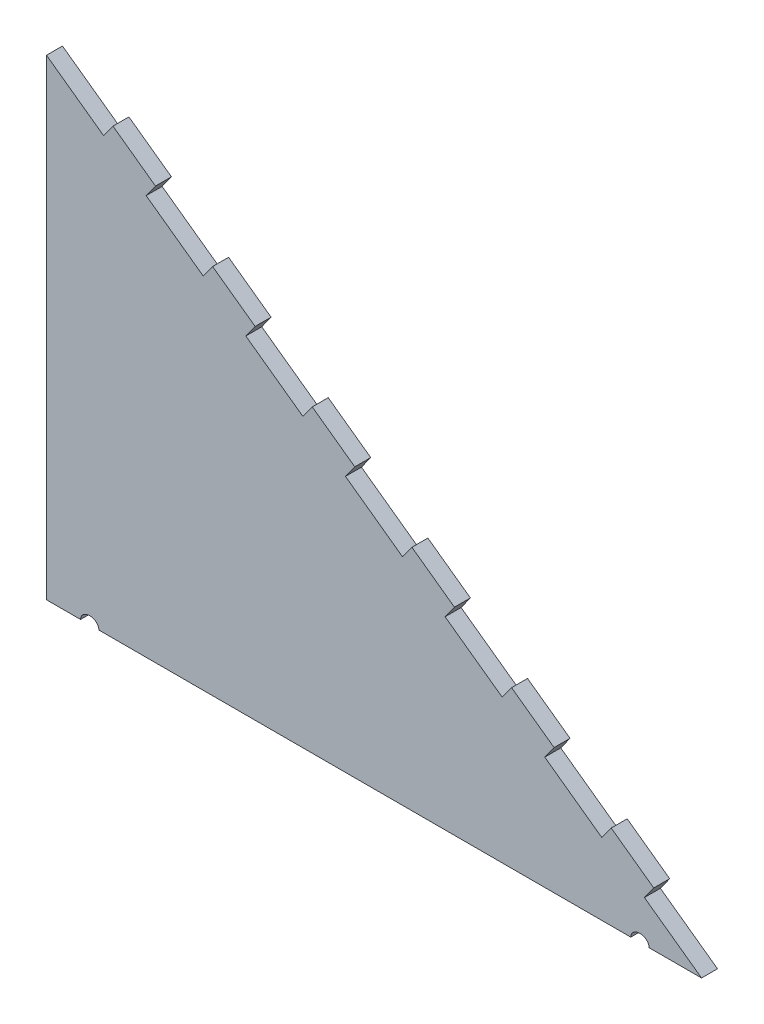
ISO-10303-21;
HEADER;
FILE_DESCRIPTION(('STEP AP214'),'2;1');
FILE_NAME('part.step','',(''),(''),'','','');
FILE_SCHEMA(('AUTOMOTIVE_DESIGN { 1 0 10303 214 1 1 1 1 }'));
ENDSEC;
DATA;
#1=APPLICATION_CONTEXT('core data for automotive mechanical design processes');
#2=APPLICATION_PROTOCOL_DEFINITION('international standard','automotive_design',2000,#1);
#3=PRODUCT_CONTEXT('',#1,'mechanical');
#4=PRODUCT('Part','Part','',(#3));
#5=PRODUCT_RELATED_PRODUCT_CATEGORY('part','',(#4));
#6=PRODUCT_DEFINITION_FORMATION('','',#4);
#7=PRODUCT_DEFINITION_CONTEXT('part definition',#1,'design');
#8=PRODUCT_DEFINITION('design','',#6,#7);
#9=PRODUCT_DEFINITION_SHAPE('','',#8);
#10=(LENGTH_UNIT() NAMED_UNIT(*) SI_UNIT(.MILLI.,.METRE.));
#11=(NAMED_UNIT(*) PLANE_ANGLE_UNIT() SI_UNIT($,.RADIAN.));
#12=(NAMED_UNIT(*) SI_UNIT($,.STERADIAN.) SOLID_ANGLE_UNIT());
#13=UNCERTAINTY_MEASURE_WITH_UNIT(LENGTH_MEASURE(1.E-05),#10,'distance_accuracy_value','');
#14=(GEOMETRIC_REPRESENTATION_CONTEXT(3) GLOBAL_UNCERTAINTY_ASSIGNED_CONTEXT((#13)) GLOBAL_UNIT_ASSIGNED_CONTEXT((#10,
#11,#12)) REPRESENTATION_CONTEXT('',''));
#15=CARTESIAN_POINT('',(0.,0.,0.));
#16=DIRECTION('',(0.,0.,1.));
#17=DIRECTION('',(1.,0.,0.));
#18=AXIS2_PLACEMENT_3D('',#15,#16,#17);
#19=CARTESIAN_POINT('',(0.,180.,6.096));
#20=DIRECTION('',(1.,0.,0.));
#21=DIRECTION('',(0.,1.,0.));
#22=AXIS2_PLACEMENT_3D('',#19,#20,#21);
#23=PLANE('',#22);
#24=DIRECTION('',(0.,-1.,0.));
#25=VECTOR('',#24,1.);
#26=CARTESIAN_POINT('',(0.,180.,0.));
#27=LINE('',#26,#25);
#28=CARTESIAN_POINT('',(0.,180.,0.));
#29=VERTEX_POINT('',#28);
#30=CARTESIAN_POINT('',(0.,0.,0.));
#31=VERTEX_POINT('',#30);
#32=EDGE_CURVE('E266',#29,#31,#27,.T.);
#33=ORIENTED_EDGE('',*,*,#32,.T.);
#34=DIRECTION('',(0.,0.,-1.));
#35=VECTOR('',#34,1.);
#36=CARTESIAN_POINT('',(0.,0.,6.096));
#37=LINE('',#36,#35);
#38=CARTESIAN_POINT('',(0.,0.,6.096));
#39=VERTEX_POINT('',#38);
#40=EDGE_CURVE('E11',#39,#31,#37,.T.);
#41=ORIENTED_EDGE('',*,*,#40,.F.);
#42=DIRECTION('',(0.,-1.,0.));
#43=VECTOR('',#42,1.);
#44=CARTESIAN_POINT('',(0.,180.,6.096));
#45=LINE('',#44,#43);
#46=CARTESIAN_POINT('',(0.,180.,6.096));
#47=VERTEX_POINT('',#46);
#48=EDGE_CURVE('E326',#47,#39,#45,.T.);
#49=ORIENTED_EDGE('',*,*,#48,.F.);
#50=DIRECTION('',(0.,0.,-1.));
#51=VECTOR('',#50,1.);
#52=CARTESIAN_POINT('',(0.,180.,6.096));
#53=LINE('',#52,#51);
#54=EDGE_CURVE('E262',#47,#29,#53,.T.);
#55=ORIENTED_EDGE('',*,*,#54,.T.);
#56=EDGE_LOOP('',(#33,#41,#49,#55));
#57=FACE_BOUND('',#56,.T.);
#58=ADVANCED_FACE('F32',(#57),#23,.F.);
#59=CARTESIAN_POINT('',(0.,0.,6.096));
#60=DIRECTION('',(0.,1.,0.));
#61=DIRECTION('',(-1.,0.,0.));
#62=AXIS2_PLACEMENT_3D('',#59,#60,#61);
#63=PLANE('',#62);
#64=DIRECTION('',(1.,0.,0.));
#65=VECTOR('',#64,1.);
#66=CARTESIAN_POINT('',(0.,0.,0.));
#67=LINE('',#66,#65);
#68=CARTESIAN_POINT('',(13.,0.,0.));
#69=VERTEX_POINT('',#68);
#70=EDGE_CURVE('E269',#31,#69,#67,.T.);
#71=ORIENTED_EDGE('',*,*,#70,.T.);
#72=DIRECTION('',(0.,0.,-1.));
#73=VECTOR('',#72,1.);
#74=CARTESIAN_POINT('',(13.,0.,6.096));
#75=LINE('',#74,#73);
#76=CARTESIAN_POINT('',(13.,0.,6.096));
#77=VERTEX_POINT('',#76);
#78=EDGE_CURVE('E40',#77,#69,#75,.T.);
#79=ORIENTED_EDGE('',*,*,#78,.F.);
#80=DIRECTION('',(1.,0.,0.));
#81=VECTOR('',#80,1.);
#82=CARTESIAN_POINT('',(0.,0.,6.096));
#83=LINE('',#82,#81);
#84=EDGE_CURVE('E160',#39,#77,#83,.T.);
#85=ORIENTED_EDGE('',*,*,#84,.F.);
#86=ORIENTED_EDGE('',*,*,#40,.T.);
#87=EDGE_LOOP('',(#71,#79,#85,#86));
#88=FACE_BOUND('',#87,.T.);
#89=ADVANCED_FACE('F445',(#88),#63,.F.);
#90=CARTESIAN_POINT('',(16.5,0.,6.096));
#91=DIRECTION('',(0.,0.,-1.));
#92=DIRECTION('',(-1.,0.,0.));
#93=AXIS2_PLACEMENT_3D('',#90,#91,#92);
#94=ELLIPSE('',#93,3.5,3.);
#95=DIRECTION('',(0.,0.,-1.));
#96=VECTOR('',#95,1.);
#97=SURFACE_OF_LINEAR_EXTRUSION('',#94,#96);
#98=CARTESIAN_POINT('',(16.5,0.,0.));
#99=DIRECTION('',(0.,0.,-1.));
#100=DIRECTION('',(-1.,0.,0.));
#101=AXIS2_PLACEMENT_3D('',#98,#99,#100);
#102=ELLIPSE('',#101,3.5,3.);
#103=CARTESIAN_POINT('',(20.,0.,0.));
#104=VERTEX_POINT('',#103);
#105=EDGE_CURVE('E271',#69,#104,#102,.T.);
#106=ORIENTED_EDGE('',*,*,#105,.T.);
#107=DIRECTION('',(0.,0.,-1.));
#108=VECTOR('',#107,1.);
#109=CARTESIAN_POINT('',(20.,0.,6.096));
#110=LINE('',#109,#108);
#111=CARTESIAN_POINT('',(20.,0.,6.096));
#112=VERTEX_POINT('',#111);
#113=EDGE_CURVE('E402',#112,#104,#110,.T.);
#114=ORIENTED_EDGE('',*,*,#113,.F.);
#115=EDGE_CURVE('E410',#77,#112,#94,.T.);
#116=ORIENTED_EDGE('',*,*,#115,.F.);
#117=ORIENTED_EDGE('',*,*,#78,.T.);
#118=EDGE_LOOP('',(#106,#114,#116,#117));
#119=FACE_BOUND('',#118,.T.);
#120=ADVANCED_FACE('F408',(#119),#97,.F.);
#121=CARTESIAN_POINT('',(20.,0.,6.096));
#122=DIRECTION('',(0.,1.,0.));
#123=DIRECTION('',(-1.,0.,0.));
#124=AXIS2_PLACEMENT_3D('',#121,#122,#123);
#125=PLANE('',#124);
#126=DIRECTION('',(1.,0.,0.));
#127=VECTOR('',#126,1.);
#128=CARTESIAN_POINT('',(20.,0.,0.));
#129=LINE('',#128,#127);
#130=CARTESIAN_POINT('',(223.,0.,0.));
#131=VERTEX_POINT('',#130);
#132=EDGE_CURVE('E273',#104,#131,#129,.T.);
#133=ORIENTED_EDGE('',*,*,#132,.T.);
#134=DIRECTION('',(0.,0.,-1.));
#135=VECTOR('',#134,1.);
#136=CARTESIAN_POINT('',(223.,0.,6.096));
#137=LINE('',#136,#135);
#138=CARTESIAN_POINT('',(223.,0.,6.096));
#139=VERTEX_POINT('',#138);
#140=EDGE_CURVE('E399',#139,#131,#137,.T.);
#141=ORIENTED_EDGE('',*,*,#140,.F.);
#142=DIRECTION('',(1.,0.,0.));
#143=VECTOR('',#142,1.);
#144=CARTESIAN_POINT('',(20.,0.,6.096));
#145=LINE('',#144,#143);
#146=EDGE_CURVE('E428',#112,#139,#145,.T.);
#147=ORIENTED_EDGE('',*,*,#146,.F.);
#148=ORIENTED_EDGE('',*,*,#113,.T.);
#149=EDGE_LOOP('',(#133,#141,#147,#148));
#150=FACE_BOUND('',#149,.T.);
#151=ADVANCED_FACE('F419',(#150),#125,.F.);
#152=CARTESIAN_POINT('',(226.5,0.,6.096));
#153=DIRECTION('',(0.,0.,-1.));
#154=DIRECTION('',(-1.,0.,0.));
#155=AXIS2_PLACEMENT_3D('',#152,#153,#154);
#156=ELLIPSE('',#155,3.5,3.);
#157=DIRECTION('',(0.,0.,-1.));
#158=VECTOR('',#157,1.);
#159=SURFACE_OF_LINEAR_EXTRUSION('',#156,#158);
#160=CARTESIAN_POINT('',(226.5,0.,0.));
#161=DIRECTION('',(0.,0.,-1.));
#162=DIRECTION('',(-1.,0.,0.));
#163=AXIS2_PLACEMENT_3D('',#160,#161,#162);
#164=ELLIPSE('',#163,3.5,3.);
#165=CARTESIAN_POINT('',(230.,0.,0.));
#166=VERTEX_POINT('',#165);
#167=EDGE_CURVE('E275',#131,#166,#164,.T.);
#168=ORIENTED_EDGE('',*,*,#167,.T.);
#169=DIRECTION('',(0.,0.,-1.));
#170=VECTOR('',#169,1.);
#171=CARTESIAN_POINT('',(230.,0.,6.096));
#172=LINE('',#171,#170);
#173=CARTESIAN_POINT('',(230.,0.,6.096));
#174=VERTEX_POINT('',#173);
#175=EDGE_CURVE('E396',#174,#166,#172,.T.);
#176=ORIENTED_EDGE('',*,*,#175,.F.);
#177=EDGE_CURVE('E425',#139,#174,#156,.T.);
#178=ORIENTED_EDGE('',*,*,#177,.F.);
#179=ORIENTED_EDGE('',*,*,#140,.T.);
#180=EDGE_LOOP('',(#168,#176,#178,#179));
#181=FACE_BOUND('',#180,.T.);
#182=ADVANCED_FACE('F423',(#181),#159,.F.);
#183=CARTESIAN_POINT('',(230.,0.,6.096));
#184=DIRECTION('',(0.,1.,0.));
#185=DIRECTION('',(-1.,0.,0.));
#186=AXIS2_PLACEMENT_3D('',#183,#184,#185);
#187=PLANE('',#186);
#188=DIRECTION('',(1.,0.,0.));
#189=VECTOR('',#188,1.);
#190=CARTESIAN_POINT('',(230.,0.,0.));
#191=LINE('',#190,#189);
#192=CARTESIAN_POINT('',(250.,0.,0.));
#193=VERTEX_POINT('',#192);
#194=EDGE_CURVE('E277',#166,#193,#191,.T.);
#195=ORIENTED_EDGE('',*,*,#194,.T.);
#196=DIRECTION('',(0.,0.,-1.));
#197=VECTOR('',#196,1.);
#198=CARTESIAN_POINT('',(250.,0.,6.096));
#199=LINE('',#198,#197);
#200=CARTESIAN_POINT('',(250.,0.,6.096));
#201=VERTEX_POINT('',#200);
#202=EDGE_CURVE('E393',#201,#193,#199,.T.);
#203=ORIENTED_EDGE('',*,*,#202,.F.);
#204=DIRECTION('',(1.,0.,0.));
#205=VECTOR('',#204,1.);
#206=CARTESIAN_POINT('',(230.,0.,6.096));
#207=LINE('',#206,#205);
#208=EDGE_CURVE('E427',#174,#201,#207,.T.);
#209=ORIENTED_EDGE('',*,*,#208,.F.);
#210=ORIENTED_EDGE('',*,*,#175,.T.);
#211=EDGE_LOOP('',(#195,#203,#209,#210));
#212=FACE_BOUND('',#211,.T.);
#213=ADVANCED_FACE('F440',(#212),#187,.F.);
#214=CARTESIAN_POINT('',(250.,0.,6.096));
#215=DIRECTION('',(-0.584304725845076,-0.811534341451494,0.));
#216=DIRECTION('',(0.811534341451495,-0.584304725845076,0.));
#217=AXIS2_PLACEMENT_3D('',#214,#215,#216);
#218=PLANE('',#217);
#219=DIRECTION('',(-0.811534341451494,0.584304725845076,0.));
#220=VECTOR('',#219,1.);
#221=CARTESIAN_POINT('',(250.,0.,0.));
#222=LINE('',#221,#220);
#223=CARTESIAN_POINT('',(228.19773156774,15.6976332712273,0.));
#224=VERTEX_POINT('',#223);
#225=EDGE_CURVE('E279',#193,#224,#222,.T.);
#226=ORIENTED_EDGE('',*,*,#225,.T.);
#227=DIRECTION('',(0.,0.,-1.));
#228=VECTOR('',#227,1.);
#229=CARTESIAN_POINT('',(228.19773156774,15.6976332712273,6.096));
#230=LINE('',#229,#228);
#231=CARTESIAN_POINT('',(228.19773156774,15.6976332712273,6.096));
#232=VERTEX_POINT('',#231);
#233=EDGE_CURVE('E390',#232,#224,#230,.T.);
#234=ORIENTED_EDGE('',*,*,#233,.F.);
#235=DIRECTION('',(-0.811534341451494,0.584304725845076,0.));
#236=VECTOR('',#235,1.);
#237=CARTESIAN_POINT('',(250.,0.,6.096));
#238=LINE('',#237,#236);
#239=EDGE_CURVE('E430',#201,#232,#238,.T.);
#240=ORIENTED_EDGE('',*,*,#239,.F.);
#241=ORIENTED_EDGE('',*,*,#202,.T.);
#242=EDGE_LOOP('',(#226,#234,#240,#241));
#243=FACE_BOUND('',#242,.T.);
#244=ADVANCED_FACE('F489',(#243),#218,.F.);
#245=CARTESIAN_POINT('',(231.759653176491,20.6447466167156,6.096));
#246=DIRECTION('',(-0.811534341451497,0.584304725845073,0.));
#247=DIRECTION('',(-0.584304725845073,-0.811534341451497,0.));
#248=AXIS2_PLACEMENT_3D('',#245,#246,#247);
#249=PLANE('',#248);
#250=DIRECTION('',(0.584304725845073,0.811534341451497,0.));
#251=VECTOR('',#250,1.);
#252=CARTESIAN_POINT('',(231.759653176491,20.6447466167156,0.));
#253=LINE('',#252,#251);
#254=CARTESIAN_POINT('',(231.759653176491,20.6447466167156,0.));
#255=VERTEX_POINT('',#254);
#256=EDGE_CURVE('E281',#224,#255,#253,.T.);
#257=ORIENTED_EDGE('',*,*,#256,.T.);
#258=DIRECTION('',(0.,0.,-1.));
#259=VECTOR('',#258,1.);
#260=CARTESIAN_POINT('',(231.759653176491,20.6447466167156,6.096));
#261=LINE('',#260,#259);
#262=CARTESIAN_POINT('',(231.759653176491,20.6447466167156,6.096));
#263=VERTEX_POINT('',#262);
#264=EDGE_CURVE('E387',#263,#255,#261,.T.);
#265=ORIENTED_EDGE('',*,*,#264,.F.);
#266=DIRECTION('',(0.584304725845073,0.811534341451497,0.));
#267=VECTOR('',#266,1.);
#268=CARTESIAN_POINT('',(231.759653176491,20.6447466167156,6.096));
#269=LINE('',#268,#267);
#270=EDGE_CURVE('E833',#232,#263,#269,.T.);
#271=ORIENTED_EDGE('',*,*,#270,.F.);
#272=ORIENTED_EDGE('',*,*,#233,.T.);
#273=EDGE_LOOP('',(#257,#265,#271,#272));
#274=FACE_BOUND('',#273,.T.);
#275=ADVANCED_FACE('F498',(#274),#249,.F.);
#276=CARTESIAN_POINT('',(215.528966347462,32.3308411336171,6.096));
#277=DIRECTION('',(-0.584304725845076,-0.811534341451494,0.));
#278=DIRECTION('',(0.811534341451495,-0.584304725845076,0.));
#279=AXIS2_PLACEMENT_3D('',#276,#277,#278);
#280=PLANE('',#279);
#281=DIRECTION('',(-0.811534341451494,0.584304725845076,0.));
#282=VECTOR('',#281,1.);
#283=CARTESIAN_POINT('',(215.528966347462,32.3308411336171,0.));
#284=LINE('',#283,#282);
#285=CARTESIAN_POINT('',(215.528966347462,32.3308411336171,0.));
#286=VERTEX_POINT('',#285);
#287=EDGE_CURVE('E283',#255,#286,#284,.T.);
#288=ORIENTED_EDGE('',*,*,#287,.T.);
#289=DIRECTION('',(0.,0.,-1.));
#290=VECTOR('',#289,1.);
#291=CARTESIAN_POINT('',(215.528966347462,32.3308411336171,6.096));
#292=LINE('',#291,#290);
#293=CARTESIAN_POINT('',(215.528966347462,32.3308411336171,6.096));
#294=VERTEX_POINT('',#293);
#295=EDGE_CURVE('E384',#294,#286,#292,.T.);
#296=ORIENTED_EDGE('',*,*,#295,.F.);
#297=DIRECTION('',(-0.811534341451494,0.584304725845076,0.));
#298=VECTOR('',#297,1.);
#299=CARTESIAN_POINT('',(215.528966347462,32.3308411336171,6.096));
#300=LINE('',#299,#298);
#301=EDGE_CURVE('E831',#263,#294,#300,.T.);
#302=ORIENTED_EDGE('',*,*,#301,.F.);
#303=ORIENTED_EDGE('',*,*,#264,.T.);
#304=EDGE_LOOP('',(#288,#296,#302,#303));
#305=FACE_BOUND('',#304,.T.);
#306=ADVANCED_FACE('F507',(#305),#280,.F.);
#307=CARTESIAN_POINT('',(211.96704473871,27.3837277881288,6.096));
#308=DIRECTION('',(0.811534341451497,-0.584304725845072,0.));
#309=DIRECTION('',(0.584304725845072,0.811534341451497,0.));
#310=AXIS2_PLACEMENT_3D('',#307,#308,#309);
#311=PLANE('',#310);
#312=DIRECTION('',(-0.584304725845072,-0.811534341451497,0.));
#313=VECTOR('',#312,1.);
#314=CARTESIAN_POINT('',(211.96704473871,27.3837277881288,0.));
#315=LINE('',#314,#313);
#316=CARTESIAN_POINT('',(211.96704473871,27.3837277881288,0.));
#317=VERTEX_POINT('',#316);
#318=EDGE_CURVE('E285',#286,#317,#315,.T.);
#319=ORIENTED_EDGE('',*,*,#318,.T.);
#320=DIRECTION('',(0.,0.,-1.));
#321=VECTOR('',#320,1.);
#322=CARTESIAN_POINT('',(211.96704473871,27.3837277881288,6.096));
#323=LINE('',#322,#321);
#324=CARTESIAN_POINT('',(211.96704473871,27.3837277881288,6.096));
#325=VERTEX_POINT('',#324);
#326=EDGE_CURVE('E381',#325,#317,#323,.T.);
#327=ORIENTED_EDGE('',*,*,#326,.F.);
#328=DIRECTION('',(-0.584304725845072,-0.811534341451497,0.));
#329=VECTOR('',#328,1.);
#330=CARTESIAN_POINT('',(211.96704473871,27.3837277881288,6.096));
#331=LINE('',#330,#329);
#332=EDGE_CURVE('E824',#294,#325,#331,.T.);
#333=ORIENTED_EDGE('',*,*,#332,.F.);
#334=ORIENTED_EDGE('',*,*,#295,.T.);
#335=EDGE_LOOP('',(#319,#327,#333,#334));
#336=FACE_BOUND('',#335,.T.);
#337=ADVANCED_FACE('F517',(#336),#311,.F.);
#338=CARTESIAN_POINT('',(211.96704473871,27.3837277881288,6.096));
#339=DIRECTION('',(-0.584304725845076,-0.811534341451494,0.));
#340=DIRECTION('',(0.811534341451494,-0.584304725845076,0.));
#341=AXIS2_PLACEMENT_3D('',#338,#339,#340);
#342=PLANE('',#341);
#343=DIRECTION('',(-0.811534341451494,0.584304725845076,0.));
#344=VECTOR('',#343,1.);
#345=CARTESIAN_POINT('',(211.96704473871,27.3837277881288,0.));
#346=LINE('',#345,#344);
#347=CARTESIAN_POINT('',(190.16477630645,43.0813610593561,0.));
#348=VERTEX_POINT('',#347);
#349=EDGE_CURVE('E287',#317,#348,#346,.T.);
#350=ORIENTED_EDGE('',*,*,#349,.T.);
#351=DIRECTION('',(0.,0.,-1.));
#352=VECTOR('',#351,1.);
#353=CARTESIAN_POINT('',(190.16477630645,43.0813610593561,6.096));
#354=LINE('',#353,#352);
#355=CARTESIAN_POINT('',(190.16477630645,43.0813610593561,6.096));
#356=VERTEX_POINT('',#355);
#357=EDGE_CURVE('E378',#356,#348,#354,.T.);
#358=ORIENTED_EDGE('',*,*,#357,.F.);
#359=DIRECTION('',(-0.811534341451494,0.584304725845076,0.));
#360=VECTOR('',#359,1.);
#361=CARTESIAN_POINT('',(211.96704473871,27.3837277881288,6.096));
#362=LINE('',#361,#360);
#363=EDGE_CURVE('E821',#325,#356,#362,.T.);
#364=ORIENTED_EDGE('',*,*,#363,.F.);
#365=ORIENTED_EDGE('',*,*,#326,.T.);
#366=EDGE_LOOP('',(#350,#358,#364,#365));
#367=FACE_BOUND('',#366,.T.);
#368=ADVANCED_FACE('F527',(#367),#342,.F.);
#369=CARTESIAN_POINT('',(193.726697915201,48.0284744048444,6.096));
#370=DIRECTION('',(-0.811534341451495,0.584304725845074,0.));
#371=DIRECTION('',(-0.584304725845075,-0.811534341451496,0.));
#372=AXIS2_PLACEMENT_3D('',#369,#370,#371);
#373=PLANE('',#372);
#374=DIRECTION('',(0.584304725845074,0.811534341451495,0.));
#375=VECTOR('',#374,1.);
#376=CARTESIAN_POINT('',(193.726697915201,48.0284744048444,0.));
#377=LINE('',#376,#375);
#378=CARTESIAN_POINT('',(193.726697915201,48.0284744048444,0.));
#379=VERTEX_POINT('',#378);
#380=EDGE_CURVE('E289',#348,#379,#377,.T.);
#381=ORIENTED_EDGE('',*,*,#380,.T.);
#382=DIRECTION('',(0.,0.,-1.));
#383=VECTOR('',#382,1.);
#384=CARTESIAN_POINT('',(193.726697915201,48.0284744048444,6.096));
#385=LINE('',#384,#383);
#386=CARTESIAN_POINT('',(193.726697915201,48.0284744048444,6.096));
#387=VERTEX_POINT('',#386);
#388=EDGE_CURVE('E375',#387,#379,#385,.T.);
#389=ORIENTED_EDGE('',*,*,#388,.F.);
#390=DIRECTION('',(0.584304725845074,0.811534341451495,0.));
#391=VECTOR('',#390,1.);
#392=CARTESIAN_POINT('',(193.726697915201,48.0284744048444,6.096));
#393=LINE('',#392,#391);
#394=EDGE_CURVE('E819',#356,#387,#393,.T.);
#395=ORIENTED_EDGE('',*,*,#394,.F.);
#396=ORIENTED_EDGE('',*,*,#357,.T.);
#397=EDGE_LOOP('',(#381,#389,#395,#396));
#398=FACE_BOUND('',#397,.T.);
#399=ADVANCED_FACE('F537',(#398),#373,.F.);
#400=CARTESIAN_POINT('',(177.496011086172,59.7145689217459,6.096));
#401=DIRECTION('',(-0.584304725845076,-0.811534341451494,0.));
#402=DIRECTION('',(0.811534341451495,-0.584304725845076,0.));
#403=AXIS2_PLACEMENT_3D('',#400,#401,#402);
#404=PLANE('',#403);
#405=DIRECTION('',(-0.811534341451494,0.584304725845076,0.));
#406=VECTOR('',#405,1.);
#407=CARTESIAN_POINT('',(177.496011086172,59.7145689217459,0.));
#408=LINE('',#407,#406);
#409=CARTESIAN_POINT('',(177.496011086172,59.7145689217459,0.));
#410=VERTEX_POINT('',#409);
#411=EDGE_CURVE('E291',#379,#410,#408,.T.);
#412=ORIENTED_EDGE('',*,*,#411,.T.);
#413=DIRECTION('',(0.,0.,-1.));
#414=VECTOR('',#413,1.);
#415=CARTESIAN_POINT('',(177.496011086172,59.7145689217459,6.096));
#416=LINE('',#415,#414);
#417=CARTESIAN_POINT('',(177.496011086172,59.7145689217459,6.096));
#418=VERTEX_POINT('',#417);
#419=EDGE_CURVE('E372',#418,#410,#416,.T.);
#420=ORIENTED_EDGE('',*,*,#419,.F.);
#421=DIRECTION('',(-0.811534341451494,0.584304725845076,0.));
#422=VECTOR('',#421,1.);
#423=CARTESIAN_POINT('',(177.496011086172,59.7145689217459,6.096));
#424=LINE('',#423,#422);
#425=EDGE_CURVE('E812',#387,#418,#424,.T.);
#426=ORIENTED_EDGE('',*,*,#425,.F.);
#427=ORIENTED_EDGE('',*,*,#388,.T.);
#428=EDGE_LOOP('',(#412,#420,#426,#427));
#429=FACE_BOUND('',#428,.T.);
#430=ADVANCED_FACE('F547',(#429),#404,.F.);
#431=CARTESIAN_POINT('',(173.93408947742,54.7674555762576,6.096));
#432=DIRECTION('',(0.811534341451496,-0.584304725845074,0.));
#433=DIRECTION('',(0.584304725845074,0.811534341451496,0.));
#434=AXIS2_PLACEMENT_3D('',#431,#432,#433);
#435=PLANE('',#434);
#436=DIRECTION('',(-0.584304725845074,-0.811534341451496,0.));
#437=VECTOR('',#436,1.);
#438=CARTESIAN_POINT('',(173.93408947742,54.7674555762576,0.));
#439=LINE('',#438,#437);
#440=CARTESIAN_POINT('',(173.93408947742,54.7674555762576,0.));
#441=VERTEX_POINT('',#440);
#442=EDGE_CURVE('E293',#410,#441,#439,.T.);
#443=ORIENTED_EDGE('',*,*,#442,.T.);
#444=DIRECTION('',(0.,0.,-1.));
#445=VECTOR('',#444,1.);
#446=CARTESIAN_POINT('',(173.93408947742,54.7674555762576,6.096));
#447=LINE('',#446,#445);
#448=CARTESIAN_POINT('',(173.93408947742,54.7674555762576,6.096));
#449=VERTEX_POINT('',#448);
#450=EDGE_CURVE('E369',#449,#441,#447,.T.);
#451=ORIENTED_EDGE('',*,*,#450,.F.);
#452=DIRECTION('',(-0.584304725845074,-0.811534341451496,0.));
#453=VECTOR('',#452,1.);
#454=CARTESIAN_POINT('',(173.93408947742,54.7674555762576,6.096));
#455=LINE('',#454,#453);
#456=EDGE_CURVE('E809',#418,#449,#455,.T.);
#457=ORIENTED_EDGE('',*,*,#456,.F.);
#458=ORIENTED_EDGE('',*,*,#419,.T.);
#459=EDGE_LOOP('',(#443,#451,#457,#458));
#460=FACE_BOUND('',#459,.T.);
#461=ADVANCED_FACE('F557',(#460),#435,.F.);
#462=CARTESIAN_POINT('',(173.93408947742,54.7674555762576,6.096));
#463=DIRECTION('',(-0.584304725845075,-0.811534341451495,0.));
#464=DIRECTION('',(0.811534341451495,-0.584304725845075,0.));
#465=AXIS2_PLACEMENT_3D('',#462,#463,#464);
#466=PLANE('',#465);
#467=DIRECTION('',(-0.811534341451495,0.584304725845075,0.));
#468=VECTOR('',#467,1.);
#469=CARTESIAN_POINT('',(173.93408947742,54.7674555762576,0.));
#470=LINE('',#469,#468);
#471=CARTESIAN_POINT('',(152.13182104516,70.4650888474848,0.));
#472=VERTEX_POINT('',#471);
#473=EDGE_CURVE('E295',#441,#472,#470,.T.);
#474=ORIENTED_EDGE('',*,*,#473,.T.);
#475=DIRECTION('',(0.,0.,-1.));
#476=VECTOR('',#475,1.);
#477=CARTESIAN_POINT('',(152.13182104516,70.4650888474848,6.096));
#478=LINE('',#477,#476);
#479=CARTESIAN_POINT('',(152.13182104516,70.4650888474848,6.096));
#480=VERTEX_POINT('',#479);
#481=EDGE_CURVE('E366',#480,#472,#478,.T.);
#482=ORIENTED_EDGE('',*,*,#481,.F.);
#483=DIRECTION('',(-0.811534341451495,0.584304725845075,0.));
#484=VECTOR('',#483,1.);
#485=CARTESIAN_POINT('',(173.93408947742,54.7674555762576,6.096));
#486=LINE('',#485,#484);
#487=EDGE_CURVE('E807',#449,#480,#486,.T.);
#488=ORIENTED_EDGE('',*,*,#487,.F.);
#489=ORIENTED_EDGE('',*,*,#450,.T.);
#490=EDGE_LOOP('',(#474,#482,#488,#489));
#491=FACE_BOUND('',#490,.T.);
#492=ADVANCED_FACE('F567',(#491),#466,.F.);
#493=CARTESIAN_POINT('',(155.693742653911,75.4122021929732,6.096));
#494=DIRECTION('',(-0.811534341451496,0.584304725845073,0.));
#495=DIRECTION('',(-0.584304725845073,-0.811534341451497,0.));
#496=AXIS2_PLACEMENT_3D('',#493,#494,#495);
#497=PLANE('',#496);
#498=DIRECTION('',(0.584304725845073,0.811534341451497,0.));
#499=VECTOR('',#498,1.);
#500=CARTESIAN_POINT('',(155.693742653911,75.4122021929732,0.));
#501=LINE('',#500,#499);
#502=CARTESIAN_POINT('',(155.693742653911,75.4122021929732,0.));
#503=VERTEX_POINT('',#502);
#504=EDGE_CURVE('E297',#472,#503,#501,.T.);
#505=ORIENTED_EDGE('',*,*,#504,.T.);
#506=DIRECTION('',(0.,0.,-1.));
#507=VECTOR('',#506,1.);
#508=CARTESIAN_POINT('',(155.693742653911,75.4122021929732,6.096));
#509=LINE('',#508,#507);
#510=CARTESIAN_POINT('',(155.693742653911,75.4122021929732,6.096));
#511=VERTEX_POINT('',#510);
#512=EDGE_CURVE('E363',#511,#503,#509,.T.);
#513=ORIENTED_EDGE('',*,*,#512,.F.);
#514=DIRECTION('',(0.584304725845073,0.811534341451497,0.));
#515=VECTOR('',#514,1.);
#516=CARTESIAN_POINT('',(155.693742653911,75.4122021929732,6.096));
#517=LINE('',#516,#515);
#518=EDGE_CURVE('E800',#480,#511,#517,.T.);
#519=ORIENTED_EDGE('',*,*,#518,.F.);
#520=ORIENTED_EDGE('',*,*,#481,.T.);
#521=EDGE_LOOP('',(#505,#513,#519,#520));
#522=FACE_BOUND('',#521,.T.);
#523=ADVANCED_FACE('F577',(#522),#497,.F.);
#524=CARTESIAN_POINT('',(139.463055824882,87.0982967098747,6.096));
#525=DIRECTION('',(-0.584304725845076,-0.811534341451495,0.));
#526=DIRECTION('',(0.811534341451495,-0.584304725845076,0.));
#527=AXIS2_PLACEMENT_3D('',#524,#525,#526);
#528=PLANE('',#527);
#529=DIRECTION('',(-0.811534341451495,0.584304725845076,0.));
#530=VECTOR('',#529,1.);
#531=CARTESIAN_POINT('',(139.463055824882,87.0982967098747,0.));
#532=LINE('',#531,#530);
#533=CARTESIAN_POINT('',(139.463055824882,87.0982967098747,0.));
#534=VERTEX_POINT('',#533);
#535=EDGE_CURVE('E299',#503,#534,#532,.T.);
#536=ORIENTED_EDGE('',*,*,#535,.T.);
#537=DIRECTION('',(0.,0.,-1.));
#538=VECTOR('',#537,1.);
#539=CARTESIAN_POINT('',(139.463055824882,87.0982967098747,6.096));
#540=LINE('',#539,#538);
#541=CARTESIAN_POINT('',(139.463055824882,87.0982967098747,6.096));
#542=VERTEX_POINT('',#541);
#543=EDGE_CURVE('E360',#542,#534,#540,.T.);
#544=ORIENTED_EDGE('',*,*,#543,.F.);
#545=DIRECTION('',(-0.811534341451495,0.584304725845076,0.));
#546=VECTOR('',#545,1.);
#547=CARTESIAN_POINT('',(139.463055824882,87.0982967098747,6.096));
#548=LINE('',#547,#546);
#549=EDGE_CURVE('E797',#511,#542,#548,.T.);
#550=ORIENTED_EDGE('',*,*,#549,.F.);
#551=ORIENTED_EDGE('',*,*,#512,.T.);
#552=EDGE_LOOP('',(#536,#544,#550,#551));
#553=FACE_BOUND('',#552,.T.);
#554=ADVANCED_FACE('F587',(#553),#528,.F.);
#555=CARTESIAN_POINT('',(135.90113421613,82.1511833643864,6.096));
#556=DIRECTION('',(0.811534341451495,-0.584304725845075,0.));
#557=DIRECTION('',(0.584304725845075,0.811534341451495,0.));
#558=AXIS2_PLACEMENT_3D('',#555,#556,#557);
#559=PLANE('',#558);
#560=DIRECTION('',(-0.584304725845075,-0.811534341451495,0.));
#561=VECTOR('',#560,1.);
#562=CARTESIAN_POINT('',(135.90113421613,82.1511833643864,0.));
#563=LINE('',#562,#561);
#564=CARTESIAN_POINT('',(135.90113421613,82.1511833643864,0.));
#565=VERTEX_POINT('',#564);
#566=EDGE_CURVE('E301',#534,#565,#563,.T.);
#567=ORIENTED_EDGE('',*,*,#566,.T.);
#568=DIRECTION('',(0.,0.,-1.));
#569=VECTOR('',#568,1.);
#570=CARTESIAN_POINT('',(135.90113421613,82.1511833643864,6.096));
#571=LINE('',#570,#569);
#572=CARTESIAN_POINT('',(135.90113421613,82.1511833643864,6.096));
#573=VERTEX_POINT('',#572);
#574=EDGE_CURVE('E357',#573,#565,#571,.T.);
#575=ORIENTED_EDGE('',*,*,#574,.F.);
#576=DIRECTION('',(-0.584304725845075,-0.811534341451495,0.));
#577=VECTOR('',#576,1.);
#578=CARTESIAN_POINT('',(135.90113421613,82.1511833643864,6.096));
#579=LINE('',#578,#577);
#580=EDGE_CURVE('E795',#542,#573,#579,.T.);
#581=ORIENTED_EDGE('',*,*,#580,.F.);
#582=ORIENTED_EDGE('',*,*,#543,.T.);
#583=EDGE_LOOP('',(#567,#575,#581,#582));
#584=FACE_BOUND('',#583,.T.);
#585=ADVANCED_FACE('F597',(#584),#559,.F.);
#586=CARTESIAN_POINT('',(135.90113421613,82.1511833643864,6.096));
#587=DIRECTION('',(-0.584304725845076,-0.811534341451495,0.));
#588=DIRECTION('',(0.811534341451495,-0.584304725845076,0.));
#589=AXIS2_PLACEMENT_3D('',#586,#587,#588);
#590=PLANE('',#589);
#591=DIRECTION('',(-0.811534341451495,0.584304725845076,0.));
#592=VECTOR('',#591,1.);
#593=CARTESIAN_POINT('',(135.90113421613,82.1511833643864,0.));
#594=LINE('',#593,#592);
#595=CARTESIAN_POINT('',(114.09886578387,97.8488166356136,0.));
#596=VERTEX_POINT('',#595);
#597=EDGE_CURVE('E303',#565,#596,#594,.T.);
#598=ORIENTED_EDGE('',*,*,#597,.T.);
#599=DIRECTION('',(0.,0.,-1.));
#600=VECTOR('',#599,1.);
#601=CARTESIAN_POINT('',(114.09886578387,97.8488166356136,6.096));
#602=LINE('',#601,#600);
#603=CARTESIAN_POINT('',(114.09886578387,97.8488166356136,6.096));
#604=VERTEX_POINT('',#603);
#605=EDGE_CURVE('E354',#604,#596,#602,.T.);
#606=ORIENTED_EDGE('',*,*,#605,.F.);
#607=DIRECTION('',(-0.811534341451495,0.584304725845076,0.));
#608=VECTOR('',#607,1.);
#609=CARTESIAN_POINT('',(135.90113421613,82.1511833643864,6.096));
#610=LINE('',#609,#608);
#611=EDGE_CURVE('E788',#573,#604,#610,.T.);
#612=ORIENTED_EDGE('',*,*,#611,.F.);
#613=ORIENTED_EDGE('',*,*,#574,.T.);
#614=EDGE_LOOP('',(#598,#606,#612,#613));
#615=FACE_BOUND('',#614,.T.);
#616=ADVANCED_FACE('F607',(#615),#590,.F.);
#617=CARTESIAN_POINT('',(117.660787392622,102.795929981102,6.096));
#618=DIRECTION('',(-0.811534341451496,0.584304725845073,0.));
#619=DIRECTION('',(-0.584304725845073,-0.811534341451496,0.));
#620=AXIS2_PLACEMENT_3D('',#617,#618,#619);
#621=PLANE('',#620);
#622=DIRECTION('',(0.584304725845073,0.811534341451496,0.));
#623=VECTOR('',#622,1.);
#624=CARTESIAN_POINT('',(117.660787392622,102.795929981102,0.));
#625=LINE('',#624,#623);
#626=CARTESIAN_POINT('',(117.660787392622,102.795929981102,0.));
#627=VERTEX_POINT('',#626);
#628=EDGE_CURVE('E305',#596,#627,#625,.T.);
#629=ORIENTED_EDGE('',*,*,#628,.T.);
#630=DIRECTION('',(0.,0.,-1.));
#631=VECTOR('',#630,1.);
#632=CARTESIAN_POINT('',(117.660787392622,102.795929981102,6.096));
#633=LINE('',#632,#631);
#634=CARTESIAN_POINT('',(117.660787392622,102.795929981102,6.096));
#635=VERTEX_POINT('',#634);
#636=EDGE_CURVE('E351',#635,#627,#633,.T.);
#637=ORIENTED_EDGE('',*,*,#636,.F.);
#638=DIRECTION('',(0.584304725845073,0.811534341451496,0.));
#639=VECTOR('',#638,1.);
#640=CARTESIAN_POINT('',(117.660787392622,102.795929981102,6.096));
#641=LINE('',#640,#639);
#642=EDGE_CURVE('E785',#604,#635,#641,.T.);
#643=ORIENTED_EDGE('',*,*,#642,.F.);
#644=ORIENTED_EDGE('',*,*,#605,.T.);
#645=EDGE_LOOP('',(#629,#637,#643,#644));
#646=FACE_BOUND('',#645,.T.);
#647=ADVANCED_FACE('F617',(#646),#621,.F.);
#648=CARTESIAN_POINT('',(101.430100563592,114.482024498003,6.096));
#649=DIRECTION('',(-0.584304725845075,-0.811534341451495,0.));
#650=DIRECTION('',(0.811534341451495,-0.584304725845075,0.));
#651=AXIS2_PLACEMENT_3D('',#648,#649,#650);
#652=PLANE('',#651);
#653=DIRECTION('',(-0.811534341451495,0.584304725845075,0.));
#654=VECTOR('',#653,1.);
#655=CARTESIAN_POINT('',(101.430100563592,114.482024498003,0.));
#656=LINE('',#655,#654);
#657=CARTESIAN_POINT('',(101.430100563592,114.482024498003,0.));
#658=VERTEX_POINT('',#657);
#659=EDGE_CURVE('E307',#627,#658,#656,.T.);
#660=ORIENTED_EDGE('',*,*,#659,.T.);
#661=DIRECTION('',(0.,0.,-1.));
#662=VECTOR('',#661,1.);
#663=CARTESIAN_POINT('',(101.430100563592,114.482024498003,6.096));
#664=LINE('',#663,#662);
#665=CARTESIAN_POINT('',(101.430100563592,114.482024498003,6.096));
#666=VERTEX_POINT('',#665);
#667=EDGE_CURVE('E348',#666,#658,#664,.T.);
#668=ORIENTED_EDGE('',*,*,#667,.F.);
#669=DIRECTION('',(-0.811534341451495,0.584304725845075,0.));
#670=VECTOR('',#669,1.);
#671=CARTESIAN_POINT('',(101.430100563592,114.482024498003,6.096));
#672=LINE('',#671,#670);
#673=EDGE_CURVE('E783',#635,#666,#672,.T.);
#674=ORIENTED_EDGE('',*,*,#673,.F.);
#675=ORIENTED_EDGE('',*,*,#636,.T.);
#676=EDGE_LOOP('',(#660,#668,#674,#675));
#677=FACE_BOUND('',#676,.T.);
#678=ADVANCED_FACE('F627',(#677),#652,.F.);
#679=CARTESIAN_POINT('',(97.8681789548401,109.534911152515,6.096));
#680=DIRECTION('',(0.811534341451496,-0.584304725845073,0.));
#681=DIRECTION('',(0.584304725845073,0.811534341451497,0.));
#682=AXIS2_PLACEMENT_3D('',#679,#680,#681);
#683=PLANE('',#682);
#684=DIRECTION('',(-0.584304725845073,-0.811534341451497,0.));
#685=VECTOR('',#684,1.);
#686=CARTESIAN_POINT('',(97.8681789548401,109.534911152515,0.));
#687=LINE('',#686,#685);
#688=CARTESIAN_POINT('',(97.8681789548401,109.534911152515,0.));
#689=VERTEX_POINT('',#688);
#690=EDGE_CURVE('E309',#658,#689,#687,.T.);
#691=ORIENTED_EDGE('',*,*,#690,.T.);
#692=DIRECTION('',(0.,0.,-1.));
#693=VECTOR('',#692,1.);
#694=CARTESIAN_POINT('',(97.8681789548401,109.534911152515,6.096));
#695=LINE('',#694,#693);
#696=CARTESIAN_POINT('',(97.8681789548401,109.534911152515,6.096));
#697=VERTEX_POINT('',#696);
#698=EDGE_CURVE('E345',#697,#689,#695,.T.);
#699=ORIENTED_EDGE('',*,*,#698,.F.);
#700=DIRECTION('',(-0.584304725845073,-0.811534341451497,0.));
#701=VECTOR('',#700,1.);
#702=CARTESIAN_POINT('',(97.8681789548401,109.534911152515,6.096));
#703=LINE('',#702,#701);
#704=EDGE_CURVE('E776',#666,#697,#703,.T.);
#705=ORIENTED_EDGE('',*,*,#704,.F.);
#706=ORIENTED_EDGE('',*,*,#667,.T.);
#707=EDGE_LOOP('',(#691,#699,#705,#706));
#708=FACE_BOUND('',#707,.T.);
#709=ADVANCED_FACE('F637',(#708),#683,.F.);
#710=CARTESIAN_POINT('',(97.8681789548401,109.534911152515,6.096));
#711=DIRECTION('',(-0.584304725845075,-0.811534341451495,0.));
#712=DIRECTION('',(0.811534341451495,-0.584304725845075,0.));
#713=AXIS2_PLACEMENT_3D('',#710,#711,#712);
#714=PLANE('',#713);
#715=DIRECTION('',(-0.811534341451495,0.584304725845076,0.));
#716=VECTOR('',#715,1.);
#717=CARTESIAN_POINT('',(97.8681789548401,109.534911152515,0.));
#718=LINE('',#717,#716);
#719=CARTESIAN_POINT('',(76.06591052258,125.232544423742,0.));
#720=VERTEX_POINT('',#719);
#721=EDGE_CURVE('E311',#689,#720,#718,.T.);
#722=ORIENTED_EDGE('',*,*,#721,.T.);
#723=DIRECTION('',(0.,0.,-1.));
#724=VECTOR('',#723,1.);
#725=CARTESIAN_POINT('',(76.06591052258,125.232544423742,6.096));
#726=LINE('',#725,#724);
#727=CARTESIAN_POINT('',(76.06591052258,125.232544423742,6.096));
#728=VERTEX_POINT('',#727);
#729=EDGE_CURVE('E342',#728,#720,#726,.T.);
#730=ORIENTED_EDGE('',*,*,#729,.F.);
#731=DIRECTION('',(-0.811534341451495,0.584304725845076,0.));
#732=VECTOR('',#731,1.);
#733=CARTESIAN_POINT('',(97.8681789548401,109.534911152515,6.096));
#734=LINE('',#733,#732);
#735=EDGE_CURVE('E773',#697,#728,#734,.T.);
#736=ORIENTED_EDGE('',*,*,#735,.F.);
#737=ORIENTED_EDGE('',*,*,#698,.T.);
#738=EDGE_LOOP('',(#722,#730,#736,#737));
#739=FACE_BOUND('',#738,.T.);
#740=ADVANCED_FACE('F647',(#739),#714,.F.);
#741=CARTESIAN_POINT('',(79.6278321313315,130.179657769231,6.096));
#742=DIRECTION('',(-0.811534341451495,0.584304725845075,0.));
#743=DIRECTION('',(-0.584304725845075,-0.811534341451495,0.));
#744=AXIS2_PLACEMENT_3D('',#741,#742,#743);
#745=PLANE('',#744);
#746=DIRECTION('',(0.584304725845075,0.811534341451495,0.));
#747=VECTOR('',#746,1.);
#748=CARTESIAN_POINT('',(79.6278321313315,130.179657769231,0.));
#749=LINE('',#748,#747);
#750=CARTESIAN_POINT('',(79.6278321313315,130.179657769231,0.));
#751=VERTEX_POINT('',#750);
#752=EDGE_CURVE('E313',#720,#751,#749,.T.);
#753=ORIENTED_EDGE('',*,*,#752,.T.);
#754=DIRECTION('',(0.,0.,-1.));
#755=VECTOR('',#754,1.);
#756=CARTESIAN_POINT('',(79.6278321313315,130.179657769231,6.096));
#757=LINE('',#756,#755);
#758=CARTESIAN_POINT('',(79.6278321313315,130.179657769231,6.096));
#759=VERTEX_POINT('',#758);
#760=EDGE_CURVE('E339',#759,#751,#757,.T.);
#761=ORIENTED_EDGE('',*,*,#760,.F.);
#762=DIRECTION('',(0.584304725845075,0.811534341451495,0.));
#763=VECTOR('',#762,1.);
#764=CARTESIAN_POINT('',(79.6278321313315,130.179657769231,6.096));
#765=LINE('',#764,#763);
#766=EDGE_CURVE('E771',#728,#759,#765,.T.);
#767=ORIENTED_EDGE('',*,*,#766,.F.);
#768=ORIENTED_EDGE('',*,*,#729,.T.);
#769=EDGE_LOOP('',(#753,#761,#767,#768));
#770=FACE_BOUND('',#769,.T.);
#771=ADVANCED_FACE('F657',(#770),#745,.F.);
#772=CARTESIAN_POINT('',(63.3971453023016,141.865752286132,6.096));
#773=DIRECTION('',(-0.584304725845075,-0.811534341451495,0.));
#774=DIRECTION('',(0.811534341451495,-0.584304725845075,0.));
#775=AXIS2_PLACEMENT_3D('',#772,#773,#774);
#776=PLANE('',#775);
#777=DIRECTION('',(-0.811534341451495,0.584304725845075,0.));
#778=VECTOR('',#777,1.);
#779=CARTESIAN_POINT('',(63.3971453023016,141.865752286132,0.));
#780=LINE('',#779,#778);
#781=CARTESIAN_POINT('',(63.3971453023016,141.865752286132,0.));
#782=VERTEX_POINT('',#781);
#783=EDGE_CURVE('E315',#751,#782,#780,.T.);
#784=ORIENTED_EDGE('',*,*,#783,.T.);
#785=DIRECTION('',(0.,0.,-1.));
#786=VECTOR('',#785,1.);
#787=CARTESIAN_POINT('',(63.3971453023016,141.865752286132,6.096));
#788=LINE('',#787,#786);
#789=CARTESIAN_POINT('',(63.3971453023016,141.865752286132,6.096));
#790=VERTEX_POINT('',#789);
#791=EDGE_CURVE('E336',#790,#782,#788,.T.);
#792=ORIENTED_EDGE('',*,*,#791,.F.);
#793=DIRECTION('',(-0.811534341451495,0.584304725845075,0.));
#794=VECTOR('',#793,1.);
#795=CARTESIAN_POINT('',(63.3971453023016,141.865752286132,6.096));
#796=LINE('',#795,#794);
#797=EDGE_CURVE('E764',#759,#790,#796,.T.);
#798=ORIENTED_EDGE('',*,*,#797,.F.);
#799=ORIENTED_EDGE('',*,*,#760,.T.);
#800=EDGE_LOOP('',(#784,#792,#798,#799));
#801=FACE_BOUND('',#800,.T.);
#802=ADVANCED_FACE('F667',(#801),#776,.F.);
#803=CARTESIAN_POINT('',(59.8352236935501,136.918638940644,6.096));
#804=DIRECTION('',(0.811534341451495,-0.584304725845075,0.));
#805=DIRECTION('',(0.584304725845075,0.811534341451495,0.));
#806=AXIS2_PLACEMENT_3D('',#803,#804,#805);
#807=PLANE('',#806);
#808=DIRECTION('',(-0.584304725845075,-0.811534341451495,0.));
#809=VECTOR('',#808,1.);
#810=CARTESIAN_POINT('',(59.8352236935501,136.918638940644,0.));
#811=LINE('',#810,#809);
#812=CARTESIAN_POINT('',(59.8352236935501,136.918638940644,0.));
#813=VERTEX_POINT('',#812);
#814=EDGE_CURVE('E317',#782,#813,#811,.T.);
#815=ORIENTED_EDGE('',*,*,#814,.T.);
#816=DIRECTION('',(0.,0.,-1.));
#817=VECTOR('',#816,1.);
#818=CARTESIAN_POINT('',(59.8352236935501,136.918638940644,6.096));
#819=LINE('',#818,#817);
#820=CARTESIAN_POINT('',(59.8352236935501,136.918638940644,6.096));
#821=VERTEX_POINT('',#820);
#822=EDGE_CURVE('E333',#821,#813,#819,.T.);
#823=ORIENTED_EDGE('',*,*,#822,.F.);
#824=DIRECTION('',(-0.584304725845075,-0.811534341451495,0.));
#825=VECTOR('',#824,1.);
#826=CARTESIAN_POINT('',(59.8352236935501,136.918638940644,6.096));
#827=LINE('',#826,#825);
#828=EDGE_CURVE('E761',#790,#821,#827,.T.);
#829=ORIENTED_EDGE('',*,*,#828,.F.);
#830=ORIENTED_EDGE('',*,*,#791,.T.);
#831=EDGE_LOOP('',(#815,#823,#829,#830));
#832=FACE_BOUND('',#831,.T.);
#833=ADVANCED_FACE('F677',(#832),#807,.F.);
#834=CARTESIAN_POINT('',(59.8352236935501,136.918638940644,6.096));
#835=DIRECTION('',(-0.584304725845076,-0.811534341451494,0.));
#836=DIRECTION('',(0.811534341451494,-0.584304725845076,0.));
#837=AXIS2_PLACEMENT_3D('',#834,#835,#836);
#838=PLANE('',#837);
#839=DIRECTION('',(-0.811534341451494,0.584304725845076,0.));
#840=VECTOR('',#839,1.);
#841=CARTESIAN_POINT('',(59.8352236935501,136.918638940644,0.));
#842=LINE('',#841,#840);
#843=CARTESIAN_POINT('',(38.03295526129,152.616272211871,0.));
#844=VERTEX_POINT('',#843);
#845=EDGE_CURVE('E319',#813,#844,#842,.T.);
#846=ORIENTED_EDGE('',*,*,#845,.T.);
#847=DIRECTION('',(0.,0.,-1.));
#848=VECTOR('',#847,1.);
#849=CARTESIAN_POINT('',(38.03295526129,152.616272211871,6.096));
#850=LINE('',#849,#848);
#851=CARTESIAN_POINT('',(38.03295526129,152.616272211871,6.096));
#852=VERTEX_POINT('',#851);
#853=EDGE_CURVE('E330',#852,#844,#850,.T.);
#854=ORIENTED_EDGE('',*,*,#853,.F.);
#855=DIRECTION('',(-0.811534341451494,0.584304725845076,0.));
#856=VECTOR('',#855,1.);
#857=CARTESIAN_POINT('',(59.8352236935501,136.918638940644,6.096));
#858=LINE('',#857,#856);
#859=EDGE_CURVE('E759',#821,#852,#858,.T.);
#860=ORIENTED_EDGE('',*,*,#859,.F.);
#861=ORIENTED_EDGE('',*,*,#822,.T.);
#862=EDGE_LOOP('',(#846,#854,#860,#861));
#863=FACE_BOUND('',#862,.T.);
#864=ADVANCED_FACE('F687',(#863),#838,.F.);
#865=CARTESIAN_POINT('',(41.5948768700416,157.56338555736,6.096));
#866=DIRECTION('',(-0.811534341451496,0.584304725845074,0.));
#867=DIRECTION('',(-0.584304725845074,-0.811534341451496,0.));
#868=AXIS2_PLACEMENT_3D('',#865,#866,#867);
#869=PLANE('',#868);
#870=DIRECTION('',(0.584304725845074,0.811534341451496,0.));
#871=VECTOR('',#870,1.);
#872=CARTESIAN_POINT('',(41.5948768700416,157.56338555736,0.));
#873=LINE('',#872,#871);
#874=CARTESIAN_POINT('',(41.5948768700416,157.56338555736,0.));
#875=VERTEX_POINT('',#874);
#876=EDGE_CURVE('E321',#844,#875,#873,.T.);
#877=ORIENTED_EDGE('',*,*,#876,.T.);
#878=DIRECTION('',(0.,0.,-1.));
#879=VECTOR('',#878,1.);
#880=CARTESIAN_POINT('',(41.5948768700416,157.56338555736,6.096));
#881=LINE('',#880,#879);
#882=CARTESIAN_POINT('',(41.5948768700416,157.56338555736,6.096));
#883=VERTEX_POINT('',#882);
#884=EDGE_CURVE('E257',#883,#875,#881,.T.);
#885=ORIENTED_EDGE('',*,*,#884,.F.);
#886=DIRECTION('',(0.584304725845074,0.811534341451496,0.));
#887=VECTOR('',#886,1.);
#888=CARTESIAN_POINT('',(41.5948768700416,157.56338555736,6.096));
#889=LINE('',#888,#887);
#890=EDGE_CURVE('E248',#852,#883,#889,.T.);
#891=ORIENTED_EDGE('',*,*,#890,.F.);
#892=ORIENTED_EDGE('',*,*,#853,.T.);
#893=EDGE_LOOP('',(#877,#885,#891,#892));
#894=FACE_BOUND('',#893,.T.);
#895=ADVANCED_FACE('F697',(#894),#869,.F.);
#896=CARTESIAN_POINT('',(25.3641900410116,169.249480074261,6.096));
#897=DIRECTION('',(-0.584304725845076,-0.811534341451495,0.));
#898=DIRECTION('',(0.811534341451495,-0.584304725845076,0.));
#899=AXIS2_PLACEMENT_3D('',#896,#897,#898);
#900=PLANE('',#899);
#901=DIRECTION('',(-0.811534341451495,0.584304725845076,0.));
#902=VECTOR('',#901,1.);
#903=CARTESIAN_POINT('',(25.3641900410116,169.249480074261,0.));
#904=LINE('',#903,#902);
#905=CARTESIAN_POINT('',(25.3641900410116,169.249480074261,0.));
#906=VERTEX_POINT('',#905);
#907=EDGE_CURVE('E256',#875,#906,#904,.T.);
#908=ORIENTED_EDGE('',*,*,#907,.T.);
#909=DIRECTION('',(0.,0.,-1.));
#910=VECTOR('',#909,1.);
#911=CARTESIAN_POINT('',(25.3641900410116,169.249480074261,6.096));
#912=LINE('',#911,#910);
#913=CARTESIAN_POINT('',(25.3641900410116,169.249480074261,6.096));
#914=VERTEX_POINT('',#913);
#915=EDGE_CURVE('E253',#914,#906,#912,.T.);
#916=ORIENTED_EDGE('',*,*,#915,.F.);
#917=DIRECTION('',(-0.811534341451495,0.584304725845076,0.));
#918=VECTOR('',#917,1.);
#919=CARTESIAN_POINT('',(25.3641900410116,169.249480074261,6.096));
#920=LINE('',#919,#918);
#921=EDGE_CURVE('E242',#883,#914,#920,.T.);
#922=ORIENTED_EDGE('',*,*,#921,.F.);
#923=ORIENTED_EDGE('',*,*,#884,.T.);
#924=EDGE_LOOP('',(#908,#916,#922,#923));
#925=FACE_BOUND('',#924,.T.);
#926=ADVANCED_FACE('F254',(#925),#900,.F.);
#927=CARTESIAN_POINT('',(21.8022684322601,164.302366728773,6.096));
#928=DIRECTION('',(0.811534341451499,-0.58430472584507,0.));
#929=DIRECTION('',(0.58430472584507,0.811534341451499,0.));
#930=AXIS2_PLACEMENT_3D('',#927,#928,#929);
#931=PLANE('',#930);
#932=DIRECTION('',(-0.58430472584507,-0.811534341451499,0.));
#933=VECTOR('',#932,1.);
#934=CARTESIAN_POINT('',(21.8022684322601,164.302366728773,0.));
#935=LINE('',#934,#933);
#936=CARTESIAN_POINT('',(21.8022684322601,164.302366728773,0.));
#937=VERTEX_POINT('',#936);
#938=EDGE_CURVE('E146',#906,#937,#935,.T.);
#939=ORIENTED_EDGE('',*,*,#938,.T.);
#940=DIRECTION('',(0.,0.,-1.));
#941=VECTOR('',#940,1.);
#942=CARTESIAN_POINT('',(21.8022684322601,164.302366728773,6.096));
#943=LINE('',#942,#941);
#944=CARTESIAN_POINT('',(21.8022684322601,164.302366728773,6.096));
#945=VERTEX_POINT('',#944);
#946=EDGE_CURVE('E258',#945,#937,#943,.T.);
#947=ORIENTED_EDGE('',*,*,#946,.F.);
#948=DIRECTION('',(-0.58430472584507,-0.811534341451499,0.));
#949=VECTOR('',#948,1.);
#950=CARTESIAN_POINT('',(21.8022684322601,164.302366728773,6.096));
#951=LINE('',#950,#949);
#952=EDGE_CURVE('E246',#914,#945,#951,.T.);
#953=ORIENTED_EDGE('',*,*,#952,.F.);
#954=ORIENTED_EDGE('',*,*,#915,.T.);
#955=EDGE_LOOP('',(#939,#947,#953,#954));
#956=FACE_BOUND('',#955,.T.);
#957=ADVANCED_FACE('F260',(#956),#931,.F.);
#958=CARTESIAN_POINT('',(21.8022684322601,164.302366728773,6.096));
#959=DIRECTION('',(-0.584304725845076,-0.811534341451494,0.));
#960=DIRECTION('',(0.811534341451494,-0.584304725845076,0.));
#961=AXIS2_PLACEMENT_3D('',#958,#959,#960);
#962=PLANE('',#961);
#963=DIRECTION('',(-0.811534341451494,0.584304725845076,0.));
#964=VECTOR('',#963,1.);
#965=CARTESIAN_POINT('',(21.8022684322601,164.302366728773,0.));
#966=LINE('',#965,#964);
#967=EDGE_CURVE('E152',#937,#29,#966,.T.);
#968=ORIENTED_EDGE('',*,*,#967,.T.);
#969=ORIENTED_EDGE('',*,*,#54,.F.);
#970=DIRECTION('',(-0.811534341451494,0.584304725845076,0.));
#971=VECTOR('',#970,1.);
#972=CARTESIAN_POINT('',(21.8022684322601,164.302366728773,6.096));
#973=LINE('',#972,#971);
#974=EDGE_CURVE('E48',#945,#47,#973,.T.);
#975=ORIENTED_EDGE('',*,*,#974,.F.);
#976=ORIENTED_EDGE('',*,*,#946,.T.);
#977=EDGE_LOOP('',(#968,#969,#975,#976));
#978=FACE_BOUND('',#977,.T.);
#979=ADVANCED_FACE('F724',(#978),#962,.F.);
#980=CARTESIAN_POINT('',(16.5,0.,6.096));
#981=DIRECTION('',(0.,0.,1.));
#982=DIRECTION('',(1.,0.,0.));
#983=AXIS2_PLACEMENT_3D('',#980,#981,#982);
#984=PLANE('',#983);
#985=ORIENTED_EDGE('',*,*,#48,.T.);
#986=ORIENTED_EDGE('',*,*,#84,.T.);
#987=ORIENTED_EDGE('',*,*,#115,.T.);
#988=ORIENTED_EDGE('',*,*,#146,.T.);
#989=ORIENTED_EDGE('',*,*,#177,.T.);
#990=ORIENTED_EDGE('',*,*,#208,.T.);
#991=ORIENTED_EDGE('',*,*,#239,.T.);
#992=ORIENTED_EDGE('',*,*,#270,.T.);
#993=ORIENTED_EDGE('',*,*,#301,.T.);
#994=ORIENTED_EDGE('',*,*,#332,.T.);
#995=ORIENTED_EDGE('',*,*,#363,.T.);
#996=ORIENTED_EDGE('',*,*,#394,.T.);
#997=ORIENTED_EDGE('',*,*,#425,.T.);
#998=ORIENTED_EDGE('',*,*,#456,.T.);
#999=ORIENTED_EDGE('',*,*,#487,.T.);
#1000=ORIENTED_EDGE('',*,*,#518,.T.);
#1001=ORIENTED_EDGE('',*,*,#549,.T.);
#1002=ORIENTED_EDGE('',*,*,#580,.T.);
#1003=ORIENTED_EDGE('',*,*,#611,.T.);
#1004=ORIENTED_EDGE('',*,*,#642,.T.);
#1005=ORIENTED_EDGE('',*,*,#673,.T.);
#1006=ORIENTED_EDGE('',*,*,#704,.T.);
#1007=ORIENTED_EDGE('',*,*,#735,.T.);
#1008=ORIENTED_EDGE('',*,*,#766,.T.);
#1009=ORIENTED_EDGE('',*,*,#797,.T.);
#1010=ORIENTED_EDGE('',*,*,#828,.T.);
#1011=ORIENTED_EDGE('',*,*,#859,.T.);
#1012=ORIENTED_EDGE('',*,*,#890,.T.);
#1013=ORIENTED_EDGE('',*,*,#921,.T.);
#1014=ORIENTED_EDGE('',*,*,#952,.T.);
#1015=ORIENTED_EDGE('',*,*,#974,.T.);
#1016=EDGE_LOOP('',(#985,#986,#987,#988,#989,#990,#991,#992,#993,#994,#995,#996,#997,#998,#999,
#1000,#1001,#1002,#1003,#1004,#1005,#1006,#1007,#1008,#1009,#1010,#1011,#1012,#1013,#1014,#1015));
#1017=FACE_BOUND('',#1016,.T.);
#1018=ADVANCED_FACE('F244',(#1017),#984,.T.);
#1019=CARTESIAN_POINT('',(16.5,0.,0.));
#1020=DIRECTION('',(0.,0.,1.));
#1021=DIRECTION('',(1.,0.,0.));
#1022=AXIS2_PLACEMENT_3D('',#1019,#1020,#1021);
#1023=PLANE('',#1022);
#1024=ORIENTED_EDGE('',*,*,#32,.F.);
#1025=ORIENTED_EDGE('',*,*,#967,.F.);
#1026=ORIENTED_EDGE('',*,*,#938,.F.);
#1027=ORIENTED_EDGE('',*,*,#907,.F.);
#1028=ORIENTED_EDGE('',*,*,#876,.F.);
#1029=ORIENTED_EDGE('',*,*,#845,.F.);
#1030=ORIENTED_EDGE('',*,*,#814,.F.);
#1031=ORIENTED_EDGE('',*,*,#783,.F.);
#1032=ORIENTED_EDGE('',*,*,#752,.F.);
#1033=ORIENTED_EDGE('',*,*,#721,.F.);
#1034=ORIENTED_EDGE('',*,*,#690,.F.);
#1035=ORIENTED_EDGE('',*,*,#659,.F.);
#1036=ORIENTED_EDGE('',*,*,#628,.F.);
#1037=ORIENTED_EDGE('',*,*,#597,.F.);
#1038=ORIENTED_EDGE('',*,*,#566,.F.);
#1039=ORIENTED_EDGE('',*,*,#535,.F.);
#1040=ORIENTED_EDGE('',*,*,#504,.F.);
#1041=ORIENTED_EDGE('',*,*,#473,.F.);
#1042=ORIENTED_EDGE('',*,*,#442,.F.);
#1043=ORIENTED_EDGE('',*,*,#411,.F.);
#1044=ORIENTED_EDGE('',*,*,#380,.F.);
#1045=ORIENTED_EDGE('',*,*,#349,.F.);
#1046=ORIENTED_EDGE('',*,*,#318,.F.);
#1047=ORIENTED_EDGE('',*,*,#287,.F.);
#1048=ORIENTED_EDGE('',*,*,#256,.F.);
#1049=ORIENTED_EDGE('',*,*,#225,.F.);
#1050=ORIENTED_EDGE('',*,*,#194,.F.);
#1051=ORIENTED_EDGE('',*,*,#167,.F.);
#1052=ORIENTED_EDGE('',*,*,#132,.F.);
#1053=ORIENTED_EDGE('',*,*,#105,.F.);
#1054=ORIENTED_EDGE('',*,*,#70,.F.);
#1055=EDGE_LOOP('',(#1024,#1025,#1026,#1027,#1028,#1029,#1030,#1031,#1032,#1033,#1034,#1035,
#1036,#1037,#1038,#1039,#1040,#1041,#1042,#1043,#1044,#1045,#1046,#1047,#1048,#1049,#1050,#1051,
#1052,#1053,#1054));
#1056=FACE_BOUND('',#1055,.T.);
#1057=ADVANCED_FACE('F414',(#1056),#1023,.F.);
#1058=CLOSED_SHELL('',(#58,#89,#120,#151,#182,#213,#244,#275,#306,#337,#368,#399,#430,#461,#492,
#523,#554,#585,#616,#647,#678,#709,#740,#771,#802,#833,#864,#895,#926,#957,#979,#1018,#1057));
#1059=MANIFOLD_SOLID_BREP('B2',#1058);
#1060=ADVANCED_BREP_SHAPE_REPRESENTATION('',(#18,#1059),#14);
#1061=SHAPE_DEFINITION_REPRESENTATION(#9,#1060);
ENDSEC;
END-ISO-10303-21;
